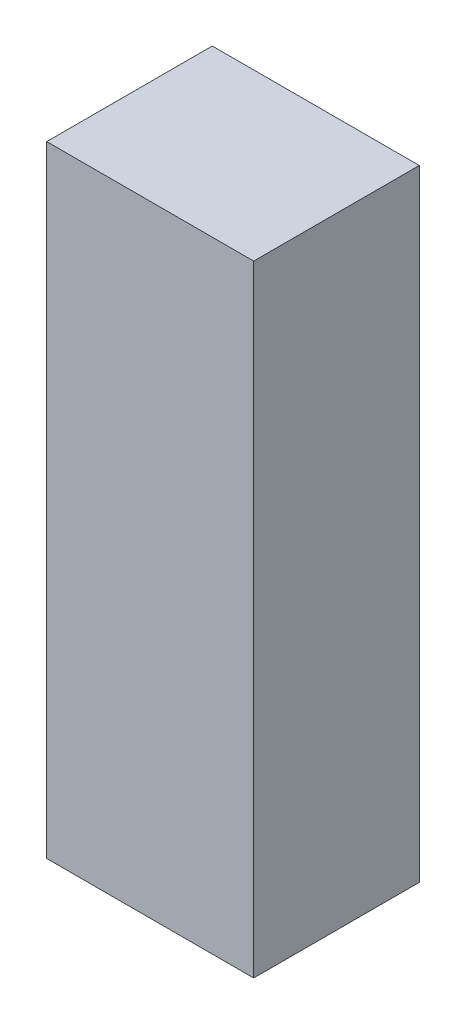
ISO-10303-21;
HEADER;
FILE_DESCRIPTION(('STEP AP214'),'2;1');
FILE_NAME('part.step','',(''),(''),'','','');
FILE_SCHEMA(('AUTOMOTIVE_DESIGN { 1 0 10303 214 1 1 1 1 }'));
ENDSEC;
DATA;
#1=APPLICATION_CONTEXT('core data for automotive mechanical design processes');
#2=APPLICATION_PROTOCOL_DEFINITION('international standard','automotive_design',2000,#1);
#3=PRODUCT_CONTEXT('',#1,'mechanical');
#4=PRODUCT('Part','Part','',(#3));
#5=PRODUCT_RELATED_PRODUCT_CATEGORY('part','',(#4));
#6=PRODUCT_DEFINITION_FORMATION('','',#4);
#7=PRODUCT_DEFINITION_CONTEXT('part definition',#1,'design');
#8=PRODUCT_DEFINITION('design','',#6,#7);
#9=PRODUCT_DEFINITION_SHAPE('','',#8);
#10=(LENGTH_UNIT() NAMED_UNIT(*) SI_UNIT(.MILLI.,.METRE.));
#11=(NAMED_UNIT(*) PLANE_ANGLE_UNIT() SI_UNIT($,.RADIAN.));
#12=(NAMED_UNIT(*) SI_UNIT($,.STERADIAN.) SOLID_ANGLE_UNIT());
#13=UNCERTAINTY_MEASURE_WITH_UNIT(LENGTH_MEASURE(1.E-05),#10,'distance_accuracy_value','');
#14=(GEOMETRIC_REPRESENTATION_CONTEXT(3) GLOBAL_UNCERTAINTY_ASSIGNED_CONTEXT((#13)) GLOBAL_UNIT_ASSIGNED_CONTEXT((#10,
#11,#12)) REPRESENTATION_CONTEXT('',''));
#15=CARTESIAN_POINT('',(0.,0.,0.));
#16=DIRECTION('',(0.,0.,1.));
#17=DIRECTION('',(1.,0.,0.));
#18=AXIS2_PLACEMENT_3D('',#15,#16,#17);
#19=CARTESIAN_POINT('',(5.,30.,4.));
#20=DIRECTION('',(-1.,0.,0.));
#21=DIRECTION('',(0.,0.,1.));
#22=AXIS2_PLACEMENT_3D('',#19,#20,#21);
#23=PLANE('',#22);
#24=DIRECTION('',(0.,0.,-1.));
#25=VECTOR('',#24,1.);
#26=CARTESIAN_POINT('',(5.,0.,4.));
#27=LINE('',#26,#25);
#28=CARTESIAN_POINT('',(5.,0.,4.));
#29=VERTEX_POINT('',#28);
#30=CARTESIAN_POINT('',(5.,0.,-4.));
#31=VERTEX_POINT('',#30);
#32=EDGE_CURVE('E96',#29,#31,#27,.T.);
#33=ORIENTED_EDGE('',*,*,#32,.T.);
#34=DIRECTION('',(0.,-1.,0.));
#35=VECTOR('',#34,1.);
#36=CARTESIAN_POINT('',(5.,30.,-4.));
#37=LINE('',#36,#35);
#38=CARTESIAN_POINT('',(5.,30.,-4.));
#39=VERTEX_POINT('',#38);
#40=EDGE_CURVE('E11',#39,#31,#37,.T.);
#41=ORIENTED_EDGE('',*,*,#40,.F.);
#42=DIRECTION('',(0.,0.,-1.));
#43=VECTOR('',#42,1.);
#44=CARTESIAN_POINT('',(5.,30.,4.));
#45=LINE('',#44,#43);
#46=CARTESIAN_POINT('',(5.,30.,4.));
#47=VERTEX_POINT('',#46);
#48=EDGE_CURVE('E84',#47,#39,#45,.T.);
#49=ORIENTED_EDGE('',*,*,#48,.F.);
#50=DIRECTION('',(0.,-1.,0.));
#51=VECTOR('',#50,1.);
#52=CARTESIAN_POINT('',(5.,30.,4.));
#53=LINE('',#52,#51);
#54=EDGE_CURVE('E92',#47,#29,#53,.T.);
#55=ORIENTED_EDGE('',*,*,#54,.T.);
#56=EDGE_LOOP('',(#33,#41,#49,#55));
#57=FACE_BOUND('',#56,.T.);
#58=ADVANCED_FACE('F33',(#57),#23,.F.);
#59=CARTESIAN_POINT('',(-5.,30.,-4.));
#60=DIRECTION('',(0.,0.,1.));
#61=DIRECTION('',(1.,0.,0.));
#62=AXIS2_PLACEMENT_3D('',#59,#60,#61);
#63=PLANE('',#62);
#64=DIRECTION('',(-1.,0.,0.));
#65=VECTOR('',#64,1.);
#66=CARTESIAN_POINT('',(-5.,0.,-4.));
#67=LINE('',#66,#65);
#68=CARTESIAN_POINT('',(-5.,0.,-4.));
#69=VERTEX_POINT('',#68);
#70=EDGE_CURVE('E88',#31,#69,#67,.T.);
#71=ORIENTED_EDGE('',*,*,#70,.T.);
#72=DIRECTION('',(0.,-1.,0.));
#73=VECTOR('',#72,1.);
#74=CARTESIAN_POINT('',(-5.,30.,-4.));
#75=LINE('',#74,#73);
#76=CARTESIAN_POINT('',(-5.,30.,-4.));
#77=VERTEX_POINT('',#76);
#78=EDGE_CURVE('E41',#77,#69,#75,.T.);
#79=ORIENTED_EDGE('',*,*,#78,.F.);
#80=DIRECTION('',(-1.,0.,0.));
#81=VECTOR('',#80,1.);
#82=CARTESIAN_POINT('',(-5.,30.,-4.));
#83=LINE('',#82,#81);
#84=EDGE_CURVE('E79',#39,#77,#83,.T.);
#85=ORIENTED_EDGE('',*,*,#84,.F.);
#86=ORIENTED_EDGE('',*,*,#40,.T.);
#87=EDGE_LOOP('',(#71,#79,#85,#86));
#88=FACE_BOUND('',#87,.T.);
#89=ADVANCED_FACE('F87',(#88),#63,.F.);
#90=CARTESIAN_POINT('',(-5.,30.,4.));
#91=DIRECTION('',(1.,0.,0.));
#92=DIRECTION('',(0.,0.,-1.));
#93=AXIS2_PLACEMENT_3D('',#90,#91,#92);
#94=PLANE('',#93);
#95=DIRECTION('',(0.,0.,1.));
#96=VECTOR('',#95,1.);
#97=CARTESIAN_POINT('',(-5.,0.,4.));
#98=LINE('',#97,#96);
#99=CARTESIAN_POINT('',(-5.,0.,4.));
#100=VERTEX_POINT('',#99);
#101=EDGE_CURVE('E66',#69,#100,#98,.T.);
#102=ORIENTED_EDGE('',*,*,#101,.T.);
#103=DIRECTION('',(0.,-1.,0.));
#104=VECTOR('',#103,1.);
#105=CARTESIAN_POINT('',(-5.,30.,4.));
#106=LINE('',#105,#104);
#107=CARTESIAN_POINT('',(-5.,30.,4.));
#108=VERTEX_POINT('',#107);
#109=EDGE_CURVE('E89',#108,#100,#106,.T.);
#110=ORIENTED_EDGE('',*,*,#109,.F.);
#111=DIRECTION('',(0.,0.,1.));
#112=VECTOR('',#111,1.);
#113=CARTESIAN_POINT('',(-5.,30.,4.));
#114=LINE('',#113,#112);
#115=EDGE_CURVE('E82',#77,#108,#114,.T.);
#116=ORIENTED_EDGE('',*,*,#115,.F.);
#117=ORIENTED_EDGE('',*,*,#78,.T.);
#118=EDGE_LOOP('',(#102,#110,#116,#117));
#119=FACE_BOUND('',#118,.T.);
#120=ADVANCED_FACE('F90',(#119),#94,.F.);
#121=CARTESIAN_POINT('',(-5.,30.,4.));
#122=DIRECTION('',(0.,0.,-1.));
#123=DIRECTION('',(-1.,0.,0.));
#124=AXIS2_PLACEMENT_3D('',#121,#122,#123);
#125=PLANE('',#124);
#126=DIRECTION('',(1.,0.,0.));
#127=VECTOR('',#126,1.);
#128=CARTESIAN_POINT('',(-5.,0.,4.));
#129=LINE('',#128,#127);
#130=EDGE_CURVE('E72',#100,#29,#129,.T.);
#131=ORIENTED_EDGE('',*,*,#130,.T.);
#132=ORIENTED_EDGE('',*,*,#54,.F.);
#133=DIRECTION('',(1.,0.,0.));
#134=VECTOR('',#133,1.);
#135=CARTESIAN_POINT('',(-5.,30.,4.));
#136=LINE('',#135,#134);
#137=EDGE_CURVE('E49',#108,#47,#136,.T.);
#138=ORIENTED_EDGE('',*,*,#137,.F.);
#139=ORIENTED_EDGE('',*,*,#109,.T.);
#140=EDGE_LOOP('',(#131,#132,#138,#139));
#141=FACE_BOUND('',#140,.T.);
#142=ADVANCED_FACE('F103',(#141),#125,.F.);
#143=CARTESIAN_POINT('',(0.,30.,0.));
#144=DIRECTION('',(0.,-1.,0.));
#145=DIRECTION('',(0.,0.,-1.));
#146=AXIS2_PLACEMENT_3D('',#143,#144,#145);
#147=PLANE('',#146);
#148=ORIENTED_EDGE('',*,*,#48,.T.);
#149=ORIENTED_EDGE('',*,*,#84,.T.);
#150=ORIENTED_EDGE('',*,*,#115,.T.);
#151=ORIENTED_EDGE('',*,*,#137,.T.);
#152=EDGE_LOOP('',(#148,#149,#150,#151));
#153=FACE_BOUND('',#152,.T.);
#154=ADVANCED_FACE('F80',(#153),#147,.F.);
#155=CARTESIAN_POINT('',(0.,0.,0.));
#156=DIRECTION('',(0.,-1.,0.));
#157=DIRECTION('',(0.,0.,-1.));
#158=AXIS2_PLACEMENT_3D('',#155,#156,#157);
#159=PLANE('',#158);
#160=ORIENTED_EDGE('',*,*,#32,.F.);
#161=ORIENTED_EDGE('',*,*,#130,.F.);
#162=ORIENTED_EDGE('',*,*,#101,.F.);
#163=ORIENTED_EDGE('',*,*,#70,.F.);
#164=EDGE_LOOP('',(#160,#161,#162,#163));
#165=FACE_BOUND('',#164,.T.);
#166=ADVANCED_FACE('F106',(#165),#159,.T.);
#167=CLOSED_SHELL('',(#58,#89,#120,#142,#154,#166));
#168=MANIFOLD_SOLID_BREP('B2',#167);
#169=ADVANCED_BREP_SHAPE_REPRESENTATION('',(#18,#168),#14);
#170=SHAPE_DEFINITION_REPRESENTATION(#9,#169);
ENDSEC;
END-ISO-10303-21;
